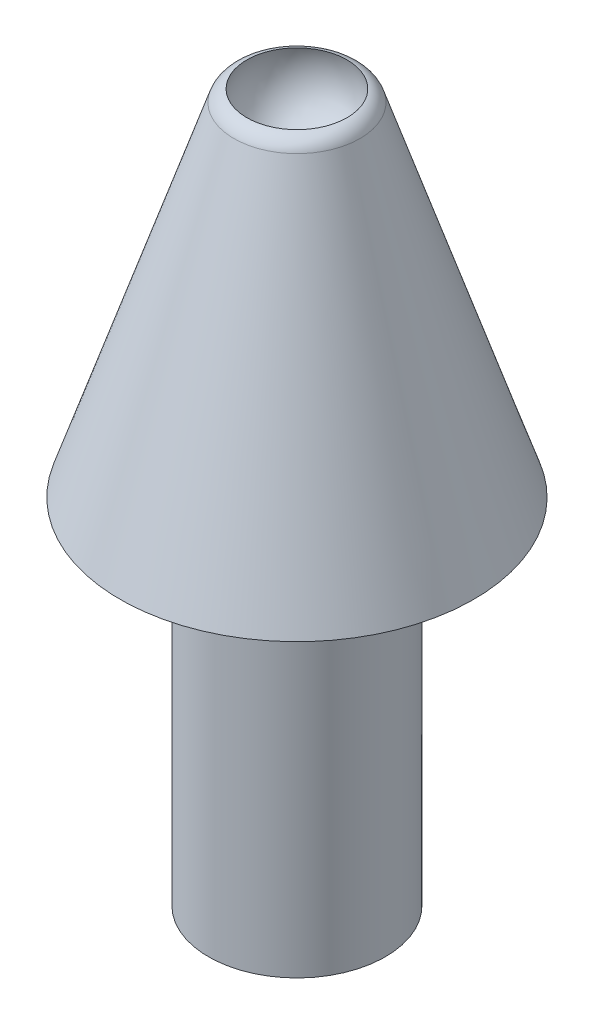
ISO-10303-21;
HEADER;
FILE_DESCRIPTION(('STEP AP214'),'2;1');
FILE_NAME('part.step','',(''),(''),'','','');
FILE_SCHEMA(('AUTOMOTIVE_DESIGN { 1 0 10303 214 1 1 1 1 }'));
ENDSEC;
DATA;
#1=APPLICATION_CONTEXT('core data for automotive mechanical design processes');
#2=APPLICATION_PROTOCOL_DEFINITION('international standard','automotive_design',2000,#1);
#3=PRODUCT_CONTEXT('',#1,'mechanical');
#4=PRODUCT('Part','Part','',(#3));
#5=PRODUCT_RELATED_PRODUCT_CATEGORY('part','',(#4));
#6=PRODUCT_DEFINITION_FORMATION('','',#4);
#7=PRODUCT_DEFINITION_CONTEXT('part definition',#1,'design');
#8=PRODUCT_DEFINITION('design','',#6,#7);
#9=PRODUCT_DEFINITION_SHAPE('','',#8);
#10=(LENGTH_UNIT() NAMED_UNIT(*) SI_UNIT(.MILLI.,.METRE.));
#11=(NAMED_UNIT(*) PLANE_ANGLE_UNIT() SI_UNIT($,.RADIAN.));
#12=(NAMED_UNIT(*) SI_UNIT($,.STERADIAN.) SOLID_ANGLE_UNIT());
#13=UNCERTAINTY_MEASURE_WITH_UNIT(LENGTH_MEASURE(1.E-05),#10,'distance_accuracy_value','');
#14=(GEOMETRIC_REPRESENTATION_CONTEXT(3) GLOBAL_UNCERTAINTY_ASSIGNED_CONTEXT((#13)) GLOBAL_UNIT_ASSIGNED_CONTEXT((#10,
#11,#12)) REPRESENTATION_CONTEXT('',''));
#15=CARTESIAN_POINT('',(0.,0.,0.));
#16=DIRECTION('',(0.,0.,1.));
#17=DIRECTION('',(1.,0.,0.));
#18=AXIS2_PLACEMENT_3D('',#15,#16,#17);
#19=CARTESIAN_POINT('',(0.399999999999878,-1.42009683733543,0.));
#20=DIRECTION('',(0.,-1.,0.));
#21=DIRECTION('',(0.,0.,-1.));
#22=AXIS2_PLACEMENT_3D('',#19,#20,#21);
#23=PLANE('',#22);
#24=CARTESIAN_POINT('',(0.,-1.42009683733546,0.));
#25=DIRECTION('',(0.,-1.,0.));
#26=DIRECTION('',(0.,0.,-1.));
#27=AXIS2_PLACEMENT_3D('',#24,#25,#26);
#28=CIRCLE('',#27,0.5);
#29=CARTESIAN_POINT('',(0.,-1.42009683733546,-0.5));
#30=VERTEX_POINT('',#29);
#31=EDGE_CURVE('E37',#30,#30,#28,.T.);
#32=ORIENTED_EDGE('',*,*,#31,.T.);
#33=EDGE_LOOP('',(#32));
#34=FACE_BOUND('',#33,.T.);
#35=CARTESIAN_POINT('',(0.,-1.42009683733546,0.));
#36=DIRECTION('',(0.,-1.,0.));
#37=DIRECTION('',(0.,0.,-1.));
#38=AXIS2_PLACEMENT_3D('',#35,#36,#37);
#39=CIRCLE('',#38,0.399999999999878);
#40=CARTESIAN_POINT('',(0.,-1.42009683733546,-0.399999999999878));
#41=VERTEX_POINT('',#40);
#42=EDGE_CURVE('E62',#41,#41,#39,.T.);
#43=ORIENTED_EDGE('',*,*,#42,.F.);
#44=EDGE_LOOP('',(#43));
#45=FACE_BOUND('',#44,.T.);
#46=ADVANCED_FACE('F30',(#34,#45),#23,.T.);
#47=CARTESIAN_POINT('',(0.,-1000.,0.));
#48=DIRECTION('',(0.,-1.,0.));
#49=DIRECTION('',(0.,0.,-1.));
#50=AXIS2_PLACEMENT_3D('',#47,#48,#49);
#51=CYLINDRICAL_SURFACE('',#50,0.5);
#52=CARTESIAN_POINT('',(0.,0.579903162664541,0.));
#53=DIRECTION('',(0.,-1.,0.));
#54=DIRECTION('',(0.,0.,-1.));
#55=AXIS2_PLACEMENT_3D('',#52,#53,#54);
#56=CIRCLE('',#55,0.5);
#57=CARTESIAN_POINT('',(0.,0.579903162664541,-0.5));
#58=VERTEX_POINT('',#57);
#59=EDGE_CURVE('E41',#58,#58,#56,.T.);
#60=ORIENTED_EDGE('',*,*,#59,.T.);
#61=EDGE_LOOP('',(#60));
#62=FACE_BOUND('',#61,.T.);
#63=ORIENTED_EDGE('',*,*,#31,.F.);
#64=EDGE_LOOP('',(#63));
#65=FACE_BOUND('',#64,.T.);
#66=ADVANCED_FACE('F70',(#62,#65),#51,.T.);
#67=CARTESIAN_POINT('',(0.5,0.579903162664568,0.));
#68=DIRECTION('',(0.,-1.,0.));
#69=DIRECTION('',(0.,0.,-1.));
#70=AXIS2_PLACEMENT_3D('',#67,#68,#69);
#71=PLANE('',#70);
#72=CARTESIAN_POINT('',(0.,0.579903162664541,0.));
#73=DIRECTION('',(0.,-1.,0.));
#74=DIRECTION('',(0.,0.,-1.));
#75=AXIS2_PLACEMENT_3D('',#72,#73,#74);
#76=CIRCLE('',#75,1.);
#77=CARTESIAN_POINT('',(0.,0.579903162664541,-1.));
#78=VERTEX_POINT('',#77);
#79=EDGE_CURVE('E45',#78,#78,#76,.T.);
#80=ORIENTED_EDGE('',*,*,#79,.T.);
#81=EDGE_LOOP('',(#80));
#82=FACE_BOUND('',#81,.T.);
#83=ORIENTED_EDGE('',*,*,#59,.F.);
#84=EDGE_LOOP('',(#83));
#85=FACE_BOUND('',#84,.T.);
#86=ADVANCED_FACE('F74',(#82,#85),#71,.T.);
#87=CARTESIAN_POINT('',(0.,0.579903162664541,0.));
#88=DIRECTION('',(0.,-1.,0.));
#89=DIRECTION('',(0.,0.,-1.));
#90=AXIS2_PLACEMENT_3D('',#87,#88,#89);
#91=CONICAL_SURFACE('',#90,1.,0.321363559708101);
#92=CARTESIAN_POINT('',(0.,2.51396159995664,0.));
#93=DIRECTION('',(0.,-1.,0.));
#94=DIRECTION('',(0.,0.,-1.));
#95=AXIS2_PLACEMENT_3D('',#92,#93,#94);
#96=CIRCLE('',#95,0.356145380725992);
#97=CARTESIAN_POINT('',(0.,2.51396159995664,-0.356145380725992));
#98=VERTEX_POINT('',#97);
#99=EDGE_CURVE('E10',#98,#98,#96,.T.);
#100=ORIENTED_EDGE('',*,*,#99,.T.);
#101=EDGE_LOOP('',(#100));
#102=FACE_BOUND('',#101,.T.);
#103=ORIENTED_EDGE('',*,*,#79,.F.);
#104=EDGE_LOOP('',(#103));
#105=FACE_BOUND('',#104,.T.);
#106=ADVANCED_FACE('F80',(#102,#105),#91,.T.);
#107=CARTESIAN_POINT('',(0.,2.48138927776823,0.));
#108=DIRECTION('',(0.,-1.,0.));
#109=DIRECTION('',(1.,0.,0.));
#110=AXIS2_PLACEMENT_3D('',#107,#108,#109);
#111=SPHERICAL_SURFACE('',#110,0.3);
#112=CARTESIAN_POINT('',(0.,2.19854656529361,0.));
#113=DIRECTION('',(0.,-1.,0.));
#114=DIRECTION('',(0.,0.,-1.));
#115=AXIS2_PLACEMENT_3D('',#112,#113,#114);
#116=CIRCLE('',#115,0.0999999999998776);
#117=CARTESIAN_POINT('',(0.100000000000001,2.19854656529361,0.));
#118=VERTEX_POINT('',#117);
#119=EDGE_CURVE('E53',#118,#118,#116,.T.);
#120=CARTESIAN_POINT('',(0.,2.57990316266454,0.));
#121=DIRECTION('',(0.,-1.,0.));
#122=DIRECTION('',(0.,0.,-1.));
#123=AXIS2_PLACEMENT_3D('',#120,#121,#122);
#124=CIRCLE('',#123,0.283363749415184);
#125=CARTESIAN_POINT('',(0.283363749415193,2.57990316266454,0.));
#126=VERTEX_POINT('',#125);
#127=EDGE_CURVE('E50',#126,#126,#124,.T.);
#128=CARTESIAN_POINT('',(0.100000000000001,2.19854656529361,0.));
#129=CARTESIAN_POINT('',(0.104612575819327,2.20017724813901,0.));
#130=CARTESIAN_POINT('',(0.10918518459057,2.20192094872794,0.));
#131=CARTESIAN_POINT('',(0.118239696899631,2.20562979475372,0.));
#132=CARTESIAN_POINT('',(0.122721600437449,2.20759494019058,0.));
#133=CARTESIAN_POINT('',(0.131583931142403,2.21174208527307,0.));
#134=CARTESIAN_POINT('',(0.135964358309538,2.2139240849187,0.));
#135=CARTESIAN_POINT('',(0.14461326613126,2.21849968685207,0.));
#136=CARTESIAN_POINT('',(0.148881746785847,2.2208932891398,0.));
#137=CARTESIAN_POINT('',(0.157296543746271,2.22588637646876,0.));
#138=CARTESIAN_POINT('',(0.161442860052109,2.22848586151,0.));
#139=CARTESIAN_POINT('',(0.169603406995846,2.23388449158209,0.));
#140=CARTESIAN_POINT('',(0.173617637633744,2.23668363661294,0.));
#141=CARTESIAN_POINT('',(0.18150440688665,2.24247488884242,0.));
#142=CARTESIAN_POINT('',(0.185376945501657,2.24546699604105,0.));
#143=CARTESIAN_POINT('',(0.192971063724922,2.25163701229074,0.));
#144=CARTESIAN_POINT('',(0.196692643333181,2.2548149213418,0.));
#145=CARTESIAN_POINT('',(0.203975937726093,2.26134893655032,0.));
#146=CARTESIAN_POINT('',(0.207537652510747,2.26470504270777,0.));
#147=CARTESIAN_POINT('',(0.214492694020211,2.27158742090193,0.));
#148=CARTESIAN_POINT('',(0.217886020745023,2.27511369293864,0.));
#149=CARTESIAN_POINT('',(0.224496165848135,2.28232796446856,0.));
#150=CARTESIAN_POINT('',(0.227712984226436,2.28601596396177,0.));
#151=CARTESIAN_POINT('',(0.233962414738719,2.29354486496179,0.));
#152=CARTESIAN_POINT('',(0.236995026872701,2.29738576646859,0.));
#153=CARTESIAN_POINT('',(0.242868787806627,2.30521128015688,0.));
#154=CARTESIAN_POINT('',(0.245709936606571,2.30919589233838,0.));
#155=CARTESIAN_POINT('',(0.251193971957656,2.31729929213494,0.));
#156=CARTESIAN_POINT('',(0.253836858508797,2.32141807975002,0.));
#157=CARTESIAN_POINT('',(0.258918044892228,2.32977997408872,0.));
#158=CARTESIAN_POINT('',(0.261356344724518,2.33402308081236,0.));
#159=CARTESIAN_POINT('',(0.266022522779521,2.34262345954552,0.));
#160=CARTESIAN_POINT('',(0.268250401002234,2.34698073155506,0.));
#161=CARTESIAN_POINT('',(0.272490404489648,2.35579901383799,0.));
#162=CARTESIAN_POINT('',(0.27450252975435,2.3602600241114,0.));
#163=CARTESIAN_POINT('',(0.278306212277612,2.36927510765273,0.));
#164=CARTESIAN_POINT('',(0.280097769536172,2.37382918092065,0.));
#165=CARTESIAN_POINT('',(0.2834560288218,2.38301949248041,0.));
#166=CARTESIAN_POINT('',(0.285022730848869,2.38765573077224,0.));
#167=CARTESIAN_POINT('',(0.287927530528373,2.39699927778699,0.));
#168=CARTESIAN_POINT('',(0.289265628180808,2.40170658650991,0.));
#169=CARTESIAN_POINT('',(0.291710017021774,2.41118100972132,0.));
#170=CARTESIAN_POINT('',(0.292816308210305,2.4159481242098,0.));
#171=CARTESIAN_POINT('',(0.294794436751071,2.42553075117071,0.));
#172=CARTESIAN_POINT('',(0.295666274103305,2.43034626364315,0.));
#173=CARTESIAN_POINT('',(0.29717340864984,2.4400141629729,0.));
#174=CARTESIAN_POINT('',(0.29780870584414,2.44486654983022,0.));
#175=CARTESIAN_POINT('',(0.298841239801483,2.45459658609083,0.));
#176=CARTESIAN_POINT('',(0.299238476564526,2.45947423549412,0.));
#177=CARTESIAN_POINT('',(0.299793939053876,2.46924312454978,0.));
#178=CARTESIAN_POINT('',(0.299952164780182,2.47413436420216,0.));
#179=CARTESIAN_POINT('',(0.300029226602323,2.48391872895343,0.));
#180=CARTESIAN_POINT('',(0.299948062698157,2.48881185405233,0.));
#181=CARTESIAN_POINT('',(0.299546539325505,2.49858828032246,0.));
#182=CARTESIAN_POINT('',(0.299226179857019,2.50347158149369,0.));
#183=CARTESIAN_POINT('',(0.298347032579619,2.51321667426599,0.));
#184=CARTESIAN_POINT('',(0.297788244770705,2.51807846586707,0.));
#185=CARTESIAN_POINT('',(0.296433575766925,2.52776890449749,0.));
#186=CARTESIAN_POINT('',(0.29563769457206,2.53259755152684,0.));
#187=CARTESIAN_POINT('',(0.293810751689315,2.54221014843218,0.));
#188=CARTESIAN_POINT('',(0.292779690001436,2.54699409830816,0.));
#189=CARTESIAN_POINT('',(0.290484822367881,2.55650584370024,0.));
#190=CARTESIAN_POINT('',(0.289221016422204,2.56123363921633,0.));
#191=CARTESIAN_POINT('',(0.286463800692551,2.57062179629949,0.));
#192=CARTESIAN_POINT('',(0.284970390908573,2.57528215786655,0.));
#193=CARTESIAN_POINT('',(0.283363749415193,2.57990316266454,0.));
#194=B_SPLINE_CURVE_WITH_KNOTS('',3,(#128,#129,#130,#131,#132,#133,#134,#135,#136,#137,#138,
#139,#140,#141,#142,#143,#144,#145,#146,#147,#148,#149,#150,#151,#152,#153,#154,#155,#156,#157,
#158,#159,#160,#161,#162,#163,#164,#165,#166,#167,#168,#169,#170,#171,#172,#173,#174,#175,#176,
#177,#178,#179,#180,#181,#182,#183,#184,#185,#186,#187,#188,#189,#190,#191,#192,#193),
.UNSPECIFIED.,.F.,.F.,(4,2,2,2,2,2,2,2,2,2,2,2,2,2,2,2,2,2,2,2,2,2,2,2,2,2,2,2,2,2,2,2,4),(0.,
0.0146755391059512,0.0293510782119022,0.0440266173178535,0.0587021564238044,0.0733776955297554,
0.0880532346357067,0.102728773741658,0.117404312847609,0.13207985195356,0.146755391059511,
0.161430930165462,0.176106469271413,0.190782008377364,0.205457547483315,0.220133086589266,
0.234808625695218,0.249484164801168,0.264159703907119,0.278835243013071,0.293510782119022,
0.308186321224973,0.322861860330924,0.337537399436875,0.352212938542826,0.366888477648777,
0.381564016754728,0.396239555860679,0.410915094966631,0.425590634072582,0.440266173178533,
0.454941712284484,0.469617251390435),.UNSPECIFIED.);
#195=EDGE_CURVE('BSEAM84',#118,#126,#194,.T.);
#196=ORIENTED_EDGE('',*,*,#119,.T.);
#197=ORIENTED_EDGE('',*,*,#127,.F.);
#198=ORIENTED_EDGE('',*,*,#195,.T.);
#199=ORIENTED_EDGE('',*,*,#195,.F.);
#200=EDGE_LOOP('',(#196,#198,#197,#199));
#201=FACE_BOUND('',#200,.T.);
#202=ADVANCED_FACE('F84',(#201),#111,.F.);
#203=CARTESIAN_POINT('',(0.,-1000.,0.));
#204=DIRECTION('',(0.,-1.,0.));
#205=DIRECTION('',(0.,0.,-1.));
#206=AXIS2_PLACEMENT_3D('',#203,#204,#205);
#207=CYLINDRICAL_SURFACE('',#206,0.0999999999998776);
#208=CARTESIAN_POINT('',(0.,0.679903162664752,0.));
#209=DIRECTION('',(0.,-1.,0.));
#210=DIRECTION('',(0.,0.,-1.));
#211=AXIS2_PLACEMENT_3D('',#208,#209,#210);
#212=CIRCLE('',#211,0.0999999999998776);
#213=CARTESIAN_POINT('',(0.,0.679903162664752,-0.0999999999998776));
#214=VERTEX_POINT('',#213);
#215=EDGE_CURVE('E56',#214,#214,#212,.T.);
#216=ORIENTED_EDGE('',*,*,#215,.T.);
#217=EDGE_LOOP('',(#216));
#218=FACE_BOUND('',#217,.T.);
#219=ORIENTED_EDGE('',*,*,#119,.F.);
#220=EDGE_LOOP('',(#219));
#221=FACE_BOUND('',#220,.T.);
#222=ADVANCED_FACE('F87',(#218,#221),#207,.F.);
#223=CARTESIAN_POINT('',(0.399999999999878,0.679903162664691,0.));
#224=DIRECTION('',(0.,-1.,0.));
#225=DIRECTION('',(0.,0.,-1.));
#226=AXIS2_PLACEMENT_3D('',#223,#224,#225);
#227=PLANE('',#226);
#228=CARTESIAN_POINT('',(0.,0.679903162664752,0.));
#229=DIRECTION('',(0.,-1.,0.));
#230=DIRECTION('',(0.,0.,-1.));
#231=AXIS2_PLACEMENT_3D('',#228,#229,#230);
#232=CIRCLE('',#231,0.399999999999878);
#233=CARTESIAN_POINT('',(0.,0.679903162664752,-0.399999999999878));
#234=VERTEX_POINT('',#233);
#235=EDGE_CURVE('E59',#234,#234,#232,.T.);
#236=ORIENTED_EDGE('',*,*,#235,.T.);
#237=EDGE_LOOP('',(#236));
#238=FACE_BOUND('',#237,.T.);
#239=ORIENTED_EDGE('',*,*,#215,.F.);
#240=EDGE_LOOP('',(#239));
#241=FACE_BOUND('',#240,.T.);
#242=ADVANCED_FACE('F91',(#238,#241),#227,.T.);
#243=CARTESIAN_POINT('',(0.,-1000.,0.));
#244=DIRECTION('',(0.,-1.,0.));
#245=DIRECTION('',(0.,0.,-1.));
#246=AXIS2_PLACEMENT_3D('',#243,#244,#245);
#247=CYLINDRICAL_SURFACE('',#246,0.399999999999878);
#248=ORIENTED_EDGE('',*,*,#42,.T.);
#249=EDGE_LOOP('',(#248));
#250=FACE_BOUND('',#249,.T.);
#251=ORIENTED_EDGE('',*,*,#235,.F.);
#252=EDGE_LOOP('',(#251));
#253=FACE_BOUND('',#252,.T.);
#254=ADVANCED_FACE('F66',(#250,#253),#247,.F.);
#255=CARTESIAN_POINT('',(0.,2.48237553926177,0.));
#256=DIRECTION('',(0.,1.,0.));
#257=DIRECTION('',(0.,0.,1.));
#258=AXIS2_PLACEMENT_3D('',#255,#256,#257);
#259=TOROIDAL_SURFACE('',#258,0.261264820178636,0.1);
#260=ORIENTED_EDGE('',*,*,#127,.T.);
#261=EDGE_LOOP('',(#260));
#262=FACE_BOUND('',#261,.T.);
#263=ORIENTED_EDGE('',*,*,#99,.F.);
#264=EDGE_LOOP('',(#263));
#265=FACE_BOUND('',#264,.T.);
#266=ADVANCED_FACE('F32',(#262,#265),#259,.T.);
#267=CLOSED_SHELL('',(#46,#66,#86,#106,#202,#222,#242,#254,#266));
#268=MANIFOLD_SOLID_BREP('B2',#267);
#269=ADVANCED_BREP_SHAPE_REPRESENTATION('',(#18,#268),#14);
#270=SHAPE_DEFINITION_REPRESENTATION(#9,#269);
ENDSEC;
END-ISO-10303-21;
